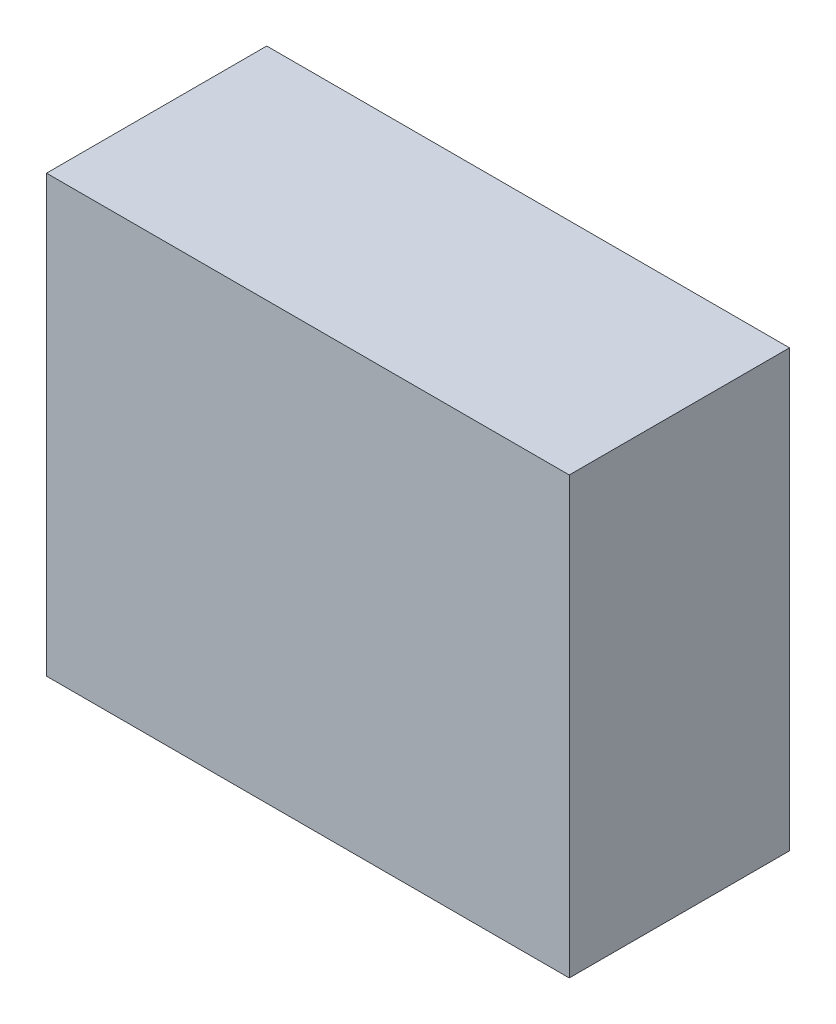
ISO-10303-21;
HEADER;
FILE_DESCRIPTION(('STEP AP214'),'2;1');
FILE_NAME('part.step','',(''),(''),'','','');
FILE_SCHEMA(('AUTOMOTIVE_DESIGN { 1 0 10303 214 1 1 1 1 }'));
ENDSEC;
DATA;
#1=APPLICATION_CONTEXT('core data for automotive mechanical design processes');
#2=APPLICATION_PROTOCOL_DEFINITION('international standard','automotive_design',2000,#1);
#3=PRODUCT_CONTEXT('',#1,'mechanical');
#4=PRODUCT('Part','Part','',(#3));
#5=PRODUCT_RELATED_PRODUCT_CATEGORY('part','',(#4));
#6=PRODUCT_DEFINITION_FORMATION('','',#4);
#7=PRODUCT_DEFINITION_CONTEXT('part definition',#1,'design');
#8=PRODUCT_DEFINITION('design','',#6,#7);
#9=PRODUCT_DEFINITION_SHAPE('','',#8);
#10=(LENGTH_UNIT() NAMED_UNIT(*) SI_UNIT(.MILLI.,.METRE.));
#11=(NAMED_UNIT(*) PLANE_ANGLE_UNIT() SI_UNIT($,.RADIAN.));
#12=(NAMED_UNIT(*) SI_UNIT($,.STERADIAN.) SOLID_ANGLE_UNIT());
#13=UNCERTAINTY_MEASURE_WITH_UNIT(LENGTH_MEASURE(1.E-05),#10,'distance_accuracy_value','');
#14=(GEOMETRIC_REPRESENTATION_CONTEXT(3) GLOBAL_UNCERTAINTY_ASSIGNED_CONTEXT((#13)) GLOBAL_UNIT_ASSIGNED_CONTEXT((#10,
#11,#12)) REPRESENTATION_CONTEXT('',''));
#15=CARTESIAN_POINT('',(0.,0.,0.));
#16=DIRECTION('',(0.,0.,1.));
#17=DIRECTION('',(1.,0.,0.));
#18=AXIS2_PLACEMENT_3D('',#15,#16,#17);
#19=CARTESIAN_POINT('',(-0.762,-0.635,0.64200024));
#20=DIRECTION('',(0.,0.,1.));
#21=DIRECTION('',(1.,0.,0.));
#22=AXIS2_PLACEMENT_3D('',#19,#20,#21);
#23=PLANE('',#22);
#24=DIRECTION('',(1.,0.,0.));
#25=VECTOR('',#24,1.);
#26=CARTESIAN_POINT('',(-0.762,0.635,0.64200024));
#27=LINE('',#26,#25);
#28=CARTESIAN_POINT('',(-0.762,0.635,0.64200024));
#29=VERTEX_POINT('',#28);
#30=CARTESIAN_POINT('',(0.762,0.635,0.64200024));
#31=VERTEX_POINT('',#30);
#32=EDGE_CURVE('E53',#29,#31,#27,.T.);
#33=ORIENTED_EDGE('',*,*,#32,.F.);
#34=DIRECTION('',(0.,1.,0.));
#35=VECTOR('',#34,1.);
#36=CARTESIAN_POINT('',(-0.762,-0.635,0.64200024));
#37=LINE('',#36,#35);
#38=CARTESIAN_POINT('',(-0.762,-0.635,0.64200024));
#39=VERTEX_POINT('',#38);
#40=EDGE_CURVE('E68',#39,#29,#37,.T.);
#41=ORIENTED_EDGE('',*,*,#40,.F.);
#42=DIRECTION('',(1.,0.,0.));
#43=VECTOR('',#42,1.);
#44=CARTESIAN_POINT('',(0.762,-0.635,0.64200024));
#45=LINE('',#44,#43);
#46=CARTESIAN_POINT('',(0.762,-0.635,0.64200024));
#47=VERTEX_POINT('',#46);
#48=EDGE_CURVE('E20',#47,#39,#45,.F.);
#49=ORIENTED_EDGE('',*,*,#48,.F.);
#50=DIRECTION('',(0.,1.,0.));
#51=VECTOR('',#50,1.);
#52=CARTESIAN_POINT('',(0.762,0.635,0.64200024));
#53=LINE('',#52,#51);
#54=EDGE_CURVE('E58',#31,#47,#53,.F.);
#55=ORIENTED_EDGE('',*,*,#54,.F.);
#56=EDGE_LOOP('',(#33,#41,#49,#55));
#57=FACE_BOUND('',#56,.T.);
#58=ADVANCED_FACE('F17',(#57),#23,.T.);
#59=CARTESIAN_POINT('',(0.762,-0.635,0.));
#60=DIRECTION('',(0.,-1.,0.));
#61=DIRECTION('',(0.,0.,-1.));
#62=AXIS2_PLACEMENT_3D('',#59,#60,#61);
#63=PLANE('',#62);
#64=DIRECTION('',(0.,0.,1.));
#65=VECTOR('',#64,1.);
#66=CARTESIAN_POINT('',(-0.762,-0.635,0.));
#67=LINE('',#66,#65);
#68=CARTESIAN_POINT('',(-0.762,-0.635,0.));
#69=VERTEX_POINT('',#68);
#70=EDGE_CURVE('E79',#69,#39,#67,.T.);
#71=ORIENTED_EDGE('',*,*,#70,.F.);
#72=DIRECTION('',(1.,0.,0.));
#73=VECTOR('',#72,1.);
#74=CARTESIAN_POINT('',(-0.762,-0.635,0.));
#75=LINE('',#74,#73);
#76=CARTESIAN_POINT('',(0.762,-0.635,0.));
#77=VERTEX_POINT('',#76);
#78=EDGE_CURVE('E74',#69,#77,#75,.T.);
#79=ORIENTED_EDGE('',*,*,#78,.T.);
#80=DIRECTION('',(0.,0.,-1.));
#81=VECTOR('',#80,1.);
#82=CARTESIAN_POINT('',(0.762,-0.635,0.));
#83=LINE('',#82,#81);
#84=EDGE_CURVE('E63',#47,#77,#83,.T.);
#85=ORIENTED_EDGE('',*,*,#84,.F.);
#86=ORIENTED_EDGE('',*,*,#48,.T.);
#87=EDGE_LOOP('',(#71,#79,#85,#86));
#88=FACE_BOUND('',#87,.T.);
#89=ADVANCED_FACE('F73',(#88),#63,.T.);
#90=CARTESIAN_POINT('',(0.762,0.635,0.));
#91=DIRECTION('',(1.,0.,0.));
#92=DIRECTION('',(0.,0.,-1.));
#93=AXIS2_PLACEMENT_3D('',#90,#91,#92);
#94=PLANE('',#93);
#95=ORIENTED_EDGE('',*,*,#84,.T.);
#96=DIRECTION('',(0.,1.,0.));
#97=VECTOR('',#96,1.);
#98=CARTESIAN_POINT('',(0.762,-0.635,0.));
#99=LINE('',#98,#97);
#100=CARTESIAN_POINT('',(0.762,0.635,0.));
#101=VERTEX_POINT('',#100);
#102=EDGE_CURVE('E84',#77,#101,#99,.T.);
#103=ORIENTED_EDGE('',*,*,#102,.T.);
#104=DIRECTION('',(0.,0.,1.));
#105=VECTOR('',#104,1.);
#106=CARTESIAN_POINT('',(0.762,0.635,0.));
#107=LINE('',#106,#105);
#108=EDGE_CURVE('E65',#31,#101,#107,.F.);
#109=ORIENTED_EDGE('',*,*,#108,.F.);
#110=ORIENTED_EDGE('',*,*,#54,.T.);
#111=EDGE_LOOP('',(#95,#103,#109,#110));
#112=FACE_BOUND('',#111,.T.);
#113=ADVANCED_FACE('F60',(#112),#94,.T.);
#114=CARTESIAN_POINT('',(-0.762,0.635,0.));
#115=DIRECTION('',(0.,1.,0.));
#116=DIRECTION('',(0.,0.,1.));
#117=AXIS2_PLACEMENT_3D('',#114,#115,#116);
#118=PLANE('',#117);
#119=ORIENTED_EDGE('',*,*,#108,.T.);
#120=DIRECTION('',(1.,0.,0.));
#121=VECTOR('',#120,1.);
#122=CARTESIAN_POINT('',(-0.762,0.635,0.));
#123=LINE('',#122,#121);
#124=CARTESIAN_POINT('',(-0.762,0.635,0.));
#125=VERTEX_POINT('',#124);
#126=EDGE_CURVE('E26',#101,#125,#123,.F.);
#127=ORIENTED_EDGE('',*,*,#126,.T.);
#128=DIRECTION('',(0.,0.,1.));
#129=VECTOR('',#128,1.);
#130=CARTESIAN_POINT('',(-0.762,0.635,0.));
#131=LINE('',#130,#129);
#132=EDGE_CURVE('E34',#29,#125,#131,.F.);
#133=ORIENTED_EDGE('',*,*,#132,.F.);
#134=ORIENTED_EDGE('',*,*,#32,.T.);
#135=EDGE_LOOP('',(#119,#127,#133,#134));
#136=FACE_BOUND('',#135,.T.);
#137=ADVANCED_FACE('F88',(#136),#118,.T.);
#138=CARTESIAN_POINT('',(-0.762,-0.635,0.));
#139=DIRECTION('',(-1.,0.,0.));
#140=DIRECTION('',(0.,0.,1.));
#141=AXIS2_PLACEMENT_3D('',#138,#139,#140);
#142=PLANE('',#141);
#143=ORIENTED_EDGE('',*,*,#132,.T.);
#144=DIRECTION('',(0.,1.,0.));
#145=VECTOR('',#144,1.);
#146=CARTESIAN_POINT('',(-0.762,-0.635,0.));
#147=LINE('',#146,#145);
#148=EDGE_CURVE('E11',#125,#69,#147,.F.);
#149=ORIENTED_EDGE('',*,*,#148,.T.);
#150=ORIENTED_EDGE('',*,*,#70,.T.);
#151=ORIENTED_EDGE('',*,*,#40,.T.);
#152=EDGE_LOOP('',(#143,#149,#150,#151));
#153=FACE_BOUND('',#152,.T.);
#154=ADVANCED_FACE('F91',(#153),#142,.T.);
#155=CARTESIAN_POINT('',(-0.762,-0.635,0.));
#156=DIRECTION('',(0.,0.,1.));
#157=DIRECTION('',(1.,0.,0.));
#158=AXIS2_PLACEMENT_3D('',#155,#156,#157);
#159=PLANE('',#158);
#160=ORIENTED_EDGE('',*,*,#126,.F.);
#161=ORIENTED_EDGE('',*,*,#102,.F.);
#162=ORIENTED_EDGE('',*,*,#78,.F.);
#163=ORIENTED_EDGE('',*,*,#148,.F.);
#164=EDGE_LOOP('',(#160,#161,#162,#163));
#165=FACE_BOUND('',#164,.T.);
#166=ADVANCED_FACE('F90',(#165),#159,.F.);
#167=CLOSED_SHELL('',(#58,#89,#113,#137,#154,#166));
#168=MANIFOLD_SOLID_BREP('B1',#167);
#169=ADVANCED_BREP_SHAPE_REPRESENTATION('',(#18,#168),#14);
#170=SHAPE_DEFINITION_REPRESENTATION(#9,#169);
ENDSEC;
END-ISO-10303-21;
